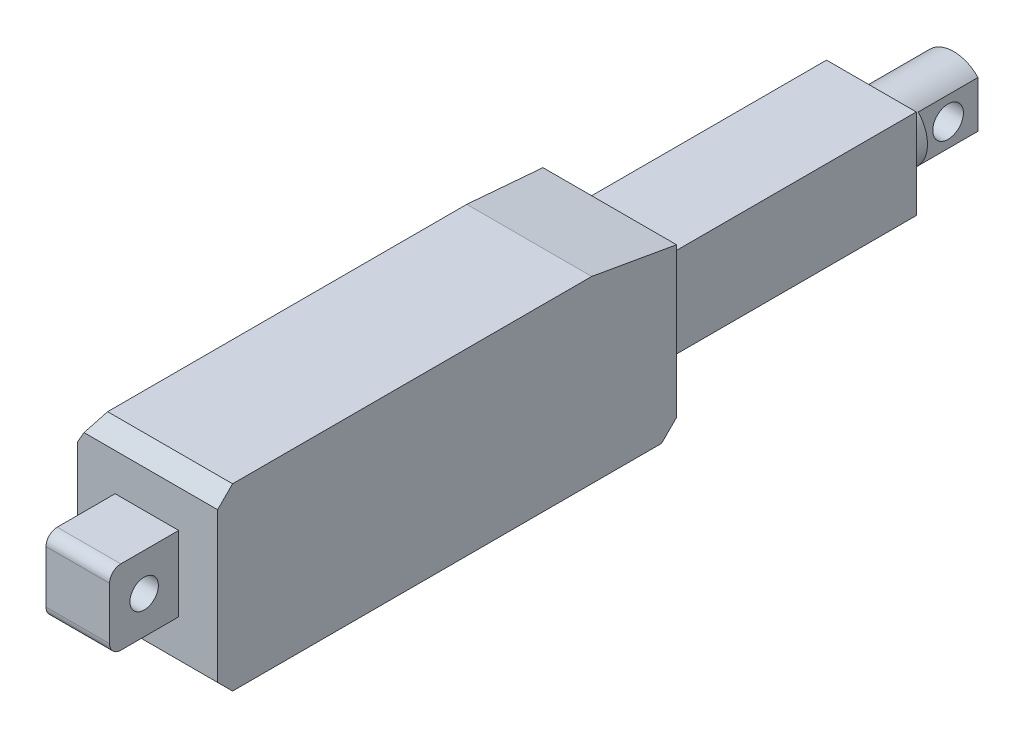
ISO-10303-21;
HEADER;
FILE_DESCRIPTION(('STEP AP214'),'2;1');
FILE_NAME('part.step','',(''),(''),'','','');
FILE_SCHEMA(('AUTOMOTIVE_DESIGN { 1 0 10303 214 1 1 1 1 }'));
ENDSEC;
DATA;
#1=APPLICATION_CONTEXT('core data for automotive mechanical design processes');
#2=APPLICATION_PROTOCOL_DEFINITION('international standard','automotive_design',2000,#1);
#3=PRODUCT_CONTEXT('',#1,'mechanical');
#4=PRODUCT('Part','Part','',(#3));
#5=PRODUCT_RELATED_PRODUCT_CATEGORY('part','',(#4));
#6=PRODUCT_DEFINITION_FORMATION('','',#4);
#7=PRODUCT_DEFINITION_CONTEXT('part definition',#1,'design');
#8=PRODUCT_DEFINITION('design','',#6,#7);
#9=PRODUCT_DEFINITION_SHAPE('','',#8);
#10=(LENGTH_UNIT() NAMED_UNIT(*) SI_UNIT(.MILLI.,.METRE.));
#11=(NAMED_UNIT(*) PLANE_ANGLE_UNIT() SI_UNIT($,.RADIAN.));
#12=(NAMED_UNIT(*) SI_UNIT($,.STERADIAN.) SOLID_ANGLE_UNIT());
#13=UNCERTAINTY_MEASURE_WITH_UNIT(LENGTH_MEASURE(1.E-05),#10,'distance_accuracy_value','');
#14=(GEOMETRIC_REPRESENTATION_CONTEXT(3) GLOBAL_UNCERTAINTY_ASSIGNED_CONTEXT((#13)) GLOBAL_UNIT_ASSIGNED_CONTEXT((#10,
#11,#12)) REPRESENTATION_CONTEXT('',''));
#15=CARTESIAN_POINT('',(0.,0.,0.));
#16=DIRECTION('',(0.,0.,1.));
#17=DIRECTION('',(1.,0.,0.));
#18=AXIS2_PLACEMENT_3D('',#15,#16,#17);
#19=CARTESIAN_POINT('',(0.,0.,-46.4));
#20=DIRECTION('',(0.,0.,1.));
#21=DIRECTION('',(1.,0.,0.));
#22=AXIS2_PLACEMENT_3D('',#19,#20,#21);
#23=CYLINDRICAL_SURFACE('',#22,4.5);
#24=CARTESIAN_POINT('',(0.,0.,-46.4));
#25=DIRECTION('',(0.,0.,-1.));
#26=DIRECTION('',(-1.,0.,0.));
#27=AXIS2_PLACEMENT_3D('',#24,#25,#26);
#28=CIRCLE('',#27,4.5);
#29=CARTESIAN_POINT('',(3.25,-3.11247489949718,-46.4));
#30=VERTEX_POINT('',#29);
#31=CARTESIAN_POINT('',(-3.25,-3.11247489949718,-46.4));
#32=VERTEX_POINT('',#31);
#33=EDGE_CURVE('E243',#30,#32,#28,.T.);
#34=ORIENTED_EDGE('',*,*,#33,.F.);
#35=DIRECTION('',(0.,0.,-1.));
#36=VECTOR('',#35,1.);
#37=CARTESIAN_POINT('',(3.25,-3.11247489949718,-38.4));
#38=LINE('',#37,#36);
#39=CARTESIAN_POINT('',(3.25,-3.11247489949718,-38.4));
#40=VERTEX_POINT('',#39);
#41=EDGE_CURVE('E237',#40,#30,#38,.T.);
#42=ORIENTED_EDGE('',*,*,#41,.F.);
#43=CARTESIAN_POINT('',(0.,0.,-38.4));
#44=DIRECTION('',(0.,0.,-1.));
#45=DIRECTION('',(-1.,0.,0.));
#46=AXIS2_PLACEMENT_3D('',#43,#44,#45);
#47=CIRCLE('',#46,4.5);
#48=CARTESIAN_POINT('',(3.25,3.11247489949718,-38.4));
#49=VERTEX_POINT('',#48);
#50=EDGE_CURVE('E231',#49,#40,#47,.T.);
#51=ORIENTED_EDGE('',*,*,#50,.F.);
#52=DIRECTION('',(0.,0.,-1.));
#53=VECTOR('',#52,1.);
#54=CARTESIAN_POINT('',(3.25,3.11247489949718,-38.4));
#55=LINE('',#54,#53);
#56=CARTESIAN_POINT('',(3.25,3.11247489949718,-46.4));
#57=VERTEX_POINT('',#56);
#58=EDGE_CURVE('E240',#49,#57,#55,.T.);
#59=ORIENTED_EDGE('',*,*,#58,.T.);
#60=CARTESIAN_POINT('',(-3.25,3.11247489949718,-46.4));
#61=VERTEX_POINT('',#60);
#62=EDGE_CURVE('E256',#61,#57,#28,.T.);
#63=ORIENTED_EDGE('',*,*,#62,.F.);
#64=DIRECTION('',(0.,0.,-1.));
#65=VECTOR('',#64,1.);
#66=CARTESIAN_POINT('',(-3.25,3.11247489949718,-38.4));
#67=LINE('',#66,#65);
#68=CARTESIAN_POINT('',(-3.25,3.11247489949718,-38.4));
#69=VERTEX_POINT('',#68);
#70=EDGE_CURVE('E239',#69,#61,#67,.T.);
#71=ORIENTED_EDGE('',*,*,#70,.F.);
#72=CARTESIAN_POINT('',(0.,0.,-38.4));
#73=DIRECTION('',(0.,0.,-1.));
#74=DIRECTION('',(-1.,0.,0.));
#75=AXIS2_PLACEMENT_3D('',#72,#73,#74);
#76=CIRCLE('',#75,4.5);
#77=CARTESIAN_POINT('',(-3.25,-3.11247489949718,-38.4));
#78=VERTEX_POINT('',#77);
#79=EDGE_CURVE('E247',#78,#69,#76,.T.);
#80=ORIENTED_EDGE('',*,*,#79,.F.);
#81=DIRECTION('',(0.,0.,-1.));
#82=VECTOR('',#81,1.);
#83=CARTESIAN_POINT('',(-3.25,-3.11247489949718,-38.4));
#84=LINE('',#83,#82);
#85=EDGE_CURVE('E250',#78,#32,#84,.T.);
#86=ORIENTED_EDGE('',*,*,#85,.T.);
#87=EDGE_LOOP('',(#34,#42,#51,#59,#63,#71,#80,#86));
#88=FACE_BOUND('',#87,.T.);
#89=CARTESIAN_POINT('',(0.,0.,-35.4));
#90=DIRECTION('',(0.,0.,-1.));
#91=DIRECTION('',(-1.,0.,0.));
#92=AXIS2_PLACEMENT_3D('',#89,#90,#91);
#93=CIRCLE('',#92,4.5);
#94=CARTESIAN_POINT('',(-4.5,0.,-35.4));
#95=VERTEX_POINT('',#94);
#96=EDGE_CURVE('E260',#95,#95,#93,.T.);
#97=ORIENTED_EDGE('',*,*,#96,.T.);
#98=EDGE_LOOP('',(#97));
#99=FACE_BOUND('',#98,.T.);
#100=ADVANCED_FACE('F35',(#88,#99),#23,.T.);
#101=CARTESIAN_POINT('',(0.,0.,-46.4));
#102=DIRECTION('',(0.,0.,-1.));
#103=DIRECTION('',(-1.,0.,0.));
#104=AXIS2_PLACEMENT_3D('',#101,#102,#103);
#105=PLANE('',#104);
#106=DIRECTION('',(0.,1.,0.));
#107=VECTOR('',#106,1.);
#108=CARTESIAN_POINT('',(3.25,0.,-46.4));
#109=LINE('',#108,#107);
#110=EDGE_CURVE('E234',#30,#57,#109,.T.);
#111=ORIENTED_EDGE('',*,*,#110,.F.);
#112=ORIENTED_EDGE('',*,*,#33,.T.);
#113=DIRECTION('',(0.,1.,0.));
#114=VECTOR('',#113,1.);
#115=CARTESIAN_POINT('',(-3.25,0.,-46.4));
#116=LINE('',#115,#114);
#117=EDGE_CURVE('E230',#32,#61,#116,.T.);
#118=ORIENTED_EDGE('',*,*,#117,.T.);
#119=ORIENTED_EDGE('',*,*,#62,.T.);
#120=EDGE_LOOP('',(#111,#112,#118,#119));
#121=FACE_BOUND('',#120,.T.);
#122=ADVANCED_FACE('F408',(#121),#105,.T.);
#123=CARTESIAN_POINT('',(0.,0.,0.));
#124=DIRECTION('',(0.,0.,1.));
#125=DIRECTION('',(1.,0.,0.));
#126=AXIS2_PLACEMENT_3D('',#123,#124,#125);
#127=PLANE('',#126);
#128=DIRECTION('',(-0.5,-0.866025403784439,0.));
#129=VECTOR('',#128,1.);
#130=CARTESIAN_POINT('',(-9.34999999999999,8.53589838486224,0.));
#131=LINE('',#130,#129);
#132=CARTESIAN_POINT('',(-9.34999999999999,8.53589838486224,0.));
#133=VERTEX_POINT('',#132);
#134=CARTESIAN_POINT('',(-8.50470053837924,10.,0.));
#135=VERTEX_POINT('',#134);
#136=EDGE_CURVE('E322',#133,#135,#131,.F.);
#137=ORIENTED_EDGE('',*,*,#136,.T.);
#138=DIRECTION('',(1.,0.,0.));
#139=VECTOR('',#138,1.);
#140=CARTESIAN_POINT('',(0.,10.,0.));
#141=LINE('',#140,#139);
#142=CARTESIAN_POINT('',(9.35000000000001,10.,0.));
#143=VERTEX_POINT('',#142);
#144=EDGE_CURVE('E368',#135,#143,#141,.T.);
#145=ORIENTED_EDGE('',*,*,#144,.T.);
#146=DIRECTION('',(0.,1.,0.));
#147=VECTOR('',#146,1.);
#148=CARTESIAN_POINT('',(9.35000000000001,-12.,0.));
#149=LINE('',#148,#147);
#150=CARTESIAN_POINT('',(9.35000000000001,-9.99999999999999,0.));
#151=VERTEX_POINT('',#150);
#152=EDGE_CURVE('E302',#151,#143,#149,.T.);
#153=ORIENTED_EDGE('',*,*,#152,.F.);
#154=DIRECTION('',(-1.,0.,0.));
#155=VECTOR('',#154,1.);
#156=CARTESIAN_POINT('',(0.,-9.99999999999999,0.));
#157=LINE('',#156,#155);
#158=CARTESIAN_POINT('',(-8.50470053837926,-9.99999999999999,0.));
#159=VERTEX_POINT('',#158);
#160=EDGE_CURVE('E361',#151,#159,#157,.T.);
#161=ORIENTED_EDGE('',*,*,#160,.T.);
#162=DIRECTION('',(0.500000000000001,-0.866025403784438,0.));
#163=VECTOR('',#162,1.);
#164=CARTESIAN_POINT('',(-7.35,-12.,0.));
#165=LINE('',#164,#163);
#166=CARTESIAN_POINT('',(-9.34999999999999,-8.53589838486226,0.));
#167=VERTEX_POINT('',#166);
#168=EDGE_CURVE('E320',#159,#167,#165,.F.);
#169=ORIENTED_EDGE('',*,*,#168,.T.);
#170=DIRECTION('',(0.,-1.,0.));
#171=VECTOR('',#170,1.);
#172=CARTESIAN_POINT('',(-9.34999999999999,-12.,0.));
#173=LINE('',#172,#171);
#174=EDGE_CURVE('E297',#133,#167,#173,.T.);
#175=ORIENTED_EDGE('',*,*,#174,.F.);
#176=EDGE_LOOP('',(#137,#145,#153,#161,#169,#175));
#177=FACE_BOUND('',#176,.T.);
#178=DIRECTION('',(0.,-1.,0.));
#179=VECTOR('',#178,1.);
#180=CARTESIAN_POINT('',(6.,-6.,0.));
#181=LINE('',#180,#179);
#182=CARTESIAN_POINT('',(6.,6.,0.));
#183=VERTEX_POINT('',#182);
#184=CARTESIAN_POINT('',(6.,-6.,0.));
#185=VERTEX_POINT('',#184);
#186=EDGE_CURVE('E259',#183,#185,#181,.T.);
#187=ORIENTED_EDGE('',*,*,#186,.F.);
#188=DIRECTION('',(1.,0.,0.));
#189=VECTOR('',#188,1.);
#190=CARTESIAN_POINT('',(-6.,6.,0.));
#191=LINE('',#190,#189);
#192=CARTESIAN_POINT('',(-6.,6.,0.));
#193=VERTEX_POINT('',#192);
#194=EDGE_CURVE('E269',#193,#183,#191,.T.);
#195=ORIENTED_EDGE('',*,*,#194,.F.);
#196=DIRECTION('',(0.,1.,0.));
#197=VECTOR('',#196,1.);
#198=CARTESIAN_POINT('',(-6.,-6.,0.));
#199=LINE('',#198,#197);
#200=CARTESIAN_POINT('',(-6.,-6.,0.));
#201=VERTEX_POINT('',#200);
#202=EDGE_CURVE('E281',#201,#193,#199,.T.);
#203=ORIENTED_EDGE('',*,*,#202,.F.);
#204=DIRECTION('',(-1.,0.,0.));
#205=VECTOR('',#204,1.);
#206=CARTESIAN_POINT('',(-6.,-6.,0.));
#207=LINE('',#206,#205);
#208=EDGE_CURVE('E278',#185,#201,#207,.T.);
#209=ORIENTED_EDGE('',*,*,#208,.F.);
#210=EDGE_LOOP('',(#187,#195,#203,#209));
#211=FACE_BOUND('',#210,.T.);
#212=ADVANCED_FACE('F414',(#177,#211),#127,.F.);
#213=CARTESIAN_POINT('',(-9.34999999999999,-12.,61.35));
#214=DIRECTION('',(1.,0.,0.));
#215=DIRECTION('',(0.,1.,0.));
#216=AXIS2_PLACEMENT_3D('',#213,#214,#215);
#217=PLANE('',#216);
#218=DIRECTION('',(0.,-1.,0.));
#219=VECTOR('',#218,1.);
#220=CARTESIAN_POINT('',(-9.34999999999999,-12.,61.35));
#221=LINE('',#220,#219);
#222=CARTESIAN_POINT('',(-9.34999999999999,8.53589838486224,61.35));
#223=VERTEX_POINT('',#222);
#224=CARTESIAN_POINT('',(-9.34999999999999,-8.53589838486226,61.35));
#225=VERTEX_POINT('',#224);
#226=EDGE_CURVE('E298',#223,#225,#221,.T.);
#227=ORIENTED_EDGE('',*,*,#226,.F.);
#228=DIRECTION('',(0.,0.,-1.));
#229=VECTOR('',#228,1.);
#230=CARTESIAN_POINT('',(-9.34999999999999,8.53589838486224,61.35));
#231=LINE('',#230,#229);
#232=EDGE_CURVE('E317',#223,#133,#231,.T.);
#233=ORIENTED_EDGE('',*,*,#232,.T.);
#234=ORIENTED_EDGE('',*,*,#174,.T.);
#235=DIRECTION('',(0.,0.,1.));
#236=VECTOR('',#235,1.);
#237=CARTESIAN_POINT('',(-9.34999999999999,-8.53589838486226,61.35));
#238=LINE('',#237,#236);
#239=EDGE_CURVE('E315',#167,#225,#238,.T.);
#240=ORIENTED_EDGE('',*,*,#239,.T.);
#241=EDGE_LOOP('',(#227,#233,#234,#240));
#242=FACE_BOUND('',#241,.T.);
#243=ADVANCED_FACE('F449',(#242),#217,.F.);
#244=CARTESIAN_POINT('',(9.35000000000001,-12.,61.35));
#245=DIRECTION('',(0.,1.,0.));
#246=DIRECTION('',(-1.,0.,0.));
#247=AXIS2_PLACEMENT_3D('',#244,#245,#246);
#248=PLANE('',#247);
#249=DIRECTION('',(0.,0.,-1.));
#250=VECTOR('',#249,1.);
#251=CARTESIAN_POINT('',(9.35000000000001,-12.,61.35));
#252=LINE('',#251,#250);
#253=CARTESIAN_POINT('',(9.35000000000001,-12.,59.35));
#254=VERTEX_POINT('',#253);
#255=CARTESIAN_POINT('',(9.35000000000001,-12.,1.99999999999999));
#256=VERTEX_POINT('',#255);
#257=EDGE_CURVE('E312',#254,#256,#252,.T.);
#258=ORIENTED_EDGE('',*,*,#257,.F.);
#259=DIRECTION('',(-1.,0.,0.));
#260=VECTOR('',#259,1.);
#261=CARTESIAN_POINT('',(-7.35,-12.,59.35));
#262=LINE('',#261,#260);
#263=CARTESIAN_POINT('',(-7.35,-12.,59.35));
#264=VERTEX_POINT('',#263);
#265=EDGE_CURVE('E355',#254,#264,#262,.T.);
#266=ORIENTED_EDGE('',*,*,#265,.T.);
#267=DIRECTION('',(0.,0.,-1.));
#268=VECTOR('',#267,1.);
#269=CARTESIAN_POINT('',(-7.35,-12.,61.35));
#270=LINE('',#269,#268);
#271=CARTESIAN_POINT('',(-7.35,-12.,1.99999999999999));
#272=VERTEX_POINT('',#271);
#273=EDGE_CURVE('E332',#264,#272,#270,.T.);
#274=ORIENTED_EDGE('',*,*,#273,.T.);
#275=DIRECTION('',(1.,0.,0.));
#276=VECTOR('',#275,1.);
#277=CARTESIAN_POINT('',(9.35000000000001,-12.,1.99999999999999));
#278=LINE('',#277,#276);
#279=EDGE_CURVE('E352',#272,#256,#278,.T.);
#280=ORIENTED_EDGE('',*,*,#279,.T.);
#281=EDGE_LOOP('',(#258,#266,#274,#280));
#282=FACE_BOUND('',#281,.T.);
#283=ADVANCED_FACE('F457',(#282),#248,.F.);
#284=CARTESIAN_POINT('',(9.35000000000001,-12.,61.35));
#285=DIRECTION('',(-1.,0.,0.));
#286=DIRECTION('',(0.,0.,1.));
#287=AXIS2_PLACEMENT_3D('',#284,#285,#286);
#288=PLANE('',#287);
#289=ORIENTED_EDGE('',*,*,#152,.T.);
#290=DIRECTION('',(0.,-0.173648177666931,-0.984807753012208));
#291=VECTOR('',#290,1.);
#292=CARTESIAN_POINT('',(9.35000000000001,12.,11.3425636392354));
#293=LINE('',#292,#291);
#294=CARTESIAN_POINT('',(9.35000000000001,12.,11.3425636392354));
#295=VERTEX_POINT('',#294);
#296=EDGE_CURVE('E264',#143,#295,#293,.F.);
#297=ORIENTED_EDGE('',*,*,#296,.T.);
#298=DIRECTION('',(0.,0.,-1.));
#299=VECTOR('',#298,1.);
#300=CARTESIAN_POINT('',(9.35000000000001,12.,61.35));
#301=LINE('',#300,#299);
#302=CARTESIAN_POINT('',(9.35000000000001,12.,59.35));
#303=VERTEX_POINT('',#302);
#304=EDGE_CURVE('E305',#303,#295,#301,.T.);
#305=ORIENTED_EDGE('',*,*,#304,.F.);
#306=DIRECTION('',(0.,-0.707106781186545,0.70710678118655));
#307=VECTOR('',#306,1.);
#308=CARTESIAN_POINT('',(9.35000000000001,10.,61.35));
#309=LINE('',#308,#307);
#310=CARTESIAN_POINT('',(9.35000000000001,10.,61.35));
#311=VERTEX_POINT('',#310);
#312=EDGE_CURVE('E350',#303,#311,#309,.T.);
#313=ORIENTED_EDGE('',*,*,#312,.T.);
#314=DIRECTION('',(0.,1.,0.));
#315=VECTOR('',#314,1.);
#316=CARTESIAN_POINT('',(9.35000000000001,-12.,61.35));
#317=LINE('',#316,#315);
#318=CARTESIAN_POINT('',(9.35000000000001,-10.,61.35));
#319=VERTEX_POINT('',#318);
#320=EDGE_CURVE('E301',#319,#311,#317,.T.);
#321=ORIENTED_EDGE('',*,*,#320,.F.);
#322=DIRECTION('',(0.,-0.707106781186545,-0.70710678118655));
#323=VECTOR('',#322,1.);
#324=CARTESIAN_POINT('',(9.35000000000001,-10.,61.35));
#325=LINE('',#324,#323);
#326=EDGE_CURVE('E348',#319,#254,#325,.T.);
#327=ORIENTED_EDGE('',*,*,#326,.T.);
#328=ORIENTED_EDGE('',*,*,#257,.T.);
#329=DIRECTION('',(0.,-0.70710678118655,0.707106781186545));
#330=VECTOR('',#329,1.);
#331=CARTESIAN_POINT('',(9.35000000000001,-12.,1.99999999999999));
#332=LINE('',#331,#330);
#333=EDGE_CURVE('E346',#256,#151,#332,.F.);
#334=ORIENTED_EDGE('',*,*,#333,.T.);
#335=EDGE_LOOP('',(#289,#297,#305,#313,#321,#327,#328,#334));
#336=FACE_BOUND('',#335,.T.);
#337=ADVANCED_FACE('F453',(#336),#288,.F.);
#338=CARTESIAN_POINT('',(9.35000000000001,12.,61.35));
#339=DIRECTION('',(0.,-1.,0.));
#340=DIRECTION('',(1.,0.,0.));
#341=AXIS2_PLACEMENT_3D('',#338,#339,#340);
#342=PLANE('',#341);
#343=ORIENTED_EDGE('',*,*,#304,.T.);
#344=DIRECTION('',(-1.,0.,0.));
#345=VECTOR('',#344,1.);
#346=CARTESIAN_POINT('',(9.35000000000001,12.,11.3425636392354));
#347=LINE('',#346,#345);
#348=CARTESIAN_POINT('',(-7.34999999999999,12.,11.3425636392354));
#349=VERTEX_POINT('',#348);
#350=EDGE_CURVE('E363',#295,#349,#347,.T.);
#351=ORIENTED_EDGE('',*,*,#350,.T.);
#352=DIRECTION('',(0.,0.,1.));
#353=VECTOR('',#352,1.);
#354=CARTESIAN_POINT('',(-7.34999999999999,12.,61.35));
#355=LINE('',#354,#353);
#356=CARTESIAN_POINT('',(-7.34999999999999,12.,59.35));
#357=VERTEX_POINT('',#356);
#358=EDGE_CURVE('E325',#349,#357,#355,.T.);
#359=ORIENTED_EDGE('',*,*,#358,.T.);
#360=DIRECTION('',(1.,0.,0.));
#361=VECTOR('',#360,1.);
#362=CARTESIAN_POINT('',(9.35000000000001,12.,59.35));
#363=LINE('',#362,#361);
#364=EDGE_CURVE('E344',#357,#303,#363,.T.);
#365=ORIENTED_EDGE('',*,*,#364,.T.);
#366=EDGE_LOOP('',(#343,#351,#359,#365));
#367=FACE_BOUND('',#366,.T.);
#368=ADVANCED_FACE('F446',(#367),#342,.F.);
#369=CARTESIAN_POINT('',(0.,0.,61.35));
#370=DIRECTION('',(0.,0.,1.));
#371=DIRECTION('',(1.,0.,0.));
#372=AXIS2_PLACEMENT_3D('',#369,#370,#371);
#373=PLANE('',#372);
#374=DIRECTION('',(0.,1.,0.));
#375=VECTOR('',#374,1.);
#376=CARTESIAN_POINT('',(4.15000000000001,-5.,61.35));
#377=LINE('',#376,#375);
#378=CARTESIAN_POINT('',(4.15000000000001,-5.,61.35));
#379=VERTEX_POINT('',#378);
#380=CARTESIAN_POINT('',(4.15000000000001,5.,61.35));
#381=VERTEX_POINT('',#380);
#382=EDGE_CURVE('E217',#379,#381,#377,.T.);
#383=ORIENTED_EDGE('',*,*,#382,.F.);
#384=DIRECTION('',(1.,0.,0.));
#385=VECTOR('',#384,1.);
#386=CARTESIAN_POINT('',(-4.34999999999999,-5.,61.35));
#387=LINE('',#386,#385);
#388=CARTESIAN_POINT('',(-4.34999999999999,-5.,61.35));
#389=VERTEX_POINT('',#388);
#390=EDGE_CURVE('E213',#389,#379,#387,.T.);
#391=ORIENTED_EDGE('',*,*,#390,.F.);
#392=DIRECTION('',(0.,-1.,0.));
#393=VECTOR('',#392,1.);
#394=CARTESIAN_POINT('',(-4.34999999999999,-5.,61.35));
#395=LINE('',#394,#393);
#396=CARTESIAN_POINT('',(-4.34999999999999,5.,61.35));
#397=VERTEX_POINT('',#396);
#398=EDGE_CURVE('E197',#397,#389,#395,.T.);
#399=ORIENTED_EDGE('',*,*,#398,.F.);
#400=DIRECTION('',(-1.,0.,0.));
#401=VECTOR('',#400,1.);
#402=CARTESIAN_POINT('',(-4.34999999999999,5.,61.35));
#403=LINE('',#402,#401);
#404=EDGE_CURVE('E210',#381,#397,#403,.T.);
#405=ORIENTED_EDGE('',*,*,#404,.F.);
#406=EDGE_LOOP('',(#383,#391,#399,#405));
#407=FACE_BOUND('',#406,.T.);
#408=ORIENTED_EDGE('',*,*,#320,.T.);
#409=DIRECTION('',(-1.,0.,0.));
#410=VECTOR('',#409,1.);
#411=CARTESIAN_POINT('',(-7.34999999999999,10.,61.35));
#412=LINE('',#411,#410);
#413=CARTESIAN_POINT('',(-8.50470053837924,10.,61.35));
#414=VERTEX_POINT('',#413);
#415=EDGE_CURVE('E338',#311,#414,#412,.T.);
#416=ORIENTED_EDGE('',*,*,#415,.T.);
#417=DIRECTION('',(0.5,0.866025403784439,0.));
#418=VECTOR('',#417,1.);
#419=CARTESIAN_POINT('',(-10.7086524227066,6.18264335890781,61.35));
#420=LINE('',#419,#418);
#421=EDGE_CURVE('E330',#414,#223,#420,.F.);
#422=ORIENTED_EDGE('',*,*,#421,.T.);
#423=ORIENTED_EDGE('',*,*,#226,.T.);
#424=DIRECTION('',(-0.500000000000001,0.866025403784438,0.));
#425=VECTOR('',#424,1.);
#426=CARTESIAN_POINT('',(-10.7086524227066,-6.18264335890782,61.35));
#427=LINE('',#426,#425);
#428=CARTESIAN_POINT('',(-8.50470053837925,-10.,61.35));
#429=VERTEX_POINT('',#428);
#430=EDGE_CURVE('E327',#225,#429,#427,.F.);
#431=ORIENTED_EDGE('',*,*,#430,.T.);
#432=DIRECTION('',(1.,0.,0.));
#433=VECTOR('',#432,1.);
#434=CARTESIAN_POINT('',(9.35000000000001,-10.,61.35));
#435=LINE('',#434,#433);
#436=EDGE_CURVE('E335',#429,#319,#435,.T.);
#437=ORIENTED_EDGE('',*,*,#436,.T.);
#438=EDGE_LOOP('',(#408,#416,#422,#423,#431,#437));
#439=FACE_BOUND('',#438,.T.);
#440=ADVANCED_FACE('F208',(#407,#439),#373,.T.);
#441=CARTESIAN_POINT('',(-9.34999999999999,8.53589838486224,61.35));
#442=DIRECTION('',(0.866025403784439,-0.5,0.));
#443=DIRECTION('',(0.,0.,-1.));
#444=AXIS2_PLACEMENT_3D('',#441,#442,#443);
#445=PLANE('',#444);
#446=ORIENTED_EDGE('',*,*,#358,.F.);
#447=DIRECTION('',(-0.0997557416394321,-0.172782012866211,-0.97989548832509));
#448=VECTOR('',#447,1.);
#449=CARTESIAN_POINT('',(-2.54137269980942,20.3287867985928,58.5774607895667));
#450=LINE('',#449,#448);
#451=EDGE_CURVE('E366',#349,#135,#450,.T.);
#452=ORIENTED_EDGE('',*,*,#451,.T.);
#453=ORIENTED_EDGE('',*,*,#136,.F.);
#454=ORIENTED_EDGE('',*,*,#232,.F.);
#455=ORIENTED_EDGE('',*,*,#421,.F.);
#456=DIRECTION('',(-0.377964473009226,-0.654653670707975,0.65465367070798));
#457=VECTOR('',#456,1.);
#458=CARTESIAN_POINT('',(-8.98772880216252,9.16337050563557,62.1866294943644));
#459=LINE('',#458,#457);
#460=EDGE_CURVE('E341',#414,#357,#459,.F.);
#461=ORIENTED_EDGE('',*,*,#460,.T.);
#462=EDGE_LOOP('',(#446,#452,#453,#454,#455,#461));
#463=FACE_BOUND('',#462,.T.);
#464=ADVANCED_FACE('F445',(#463),#445,.F.);
#465=CARTESIAN_POINT('',(-7.35,-12.,61.35));
#466=DIRECTION('',(0.866025403784438,0.500000000000001,0.));
#467=DIRECTION('',(0.,0.,-1.));
#468=AXIS2_PLACEMENT_3D('',#465,#466,#467);
#469=PLANE('',#468);
#470=ORIENTED_EDGE('',*,*,#273,.F.);
#471=DIRECTION('',(0.377964473009227,-0.654653670707975,-0.65465367070798));
#472=VECTOR('',#471,1.);
#473=CARTESIAN_POINT('',(-7.8448716593054,-11.1428571428571,60.2071428571429));
#474=LINE('',#473,#472);
#475=EDGE_CURVE('E359',#264,#429,#474,.F.);
#476=ORIENTED_EDGE('',*,*,#475,.T.);
#477=ORIENTED_EDGE('',*,*,#430,.F.);
#478=ORIENTED_EDGE('',*,*,#239,.F.);
#479=ORIENTED_EDGE('',*,*,#168,.F.);
#480=DIRECTION('',(0.377964473009229,-0.654653670707979,0.654653670707975));
#481=VECTOR('',#480,1.);
#482=CARTESIAN_POINT('',(7.33531648988756,-37.4357142857143,27.4357142857141));
#483=LINE('',#482,#481);
#484=EDGE_CURVE('E357',#159,#272,#483,.T.);
#485=ORIENTED_EDGE('',*,*,#484,.T.);
#486=EDGE_LOOP('',(#470,#476,#477,#478,#479,#485));
#487=FACE_BOUND('',#486,.T.);
#488=ADVANCED_FACE('F471',(#487),#469,.F.);
#489=CARTESIAN_POINT('',(0.,10.,61.35));
#490=DIRECTION('',(0.,0.70710678118655,0.707106781186545));
#491=DIRECTION('',(1.,0.,0.));
#492=AXIS2_PLACEMENT_3D('',#489,#490,#491);
#493=PLANE('',#492);
#494=ORIENTED_EDGE('',*,*,#312,.F.);
#495=ORIENTED_EDGE('',*,*,#364,.F.);
#496=ORIENTED_EDGE('',*,*,#460,.F.);
#497=ORIENTED_EDGE('',*,*,#415,.F.);
#498=EDGE_LOOP('',(#494,#495,#496,#497));
#499=FACE_BOUND('',#498,.T.);
#500=ADVANCED_FACE('F478',(#499),#493,.T.);
#501=CARTESIAN_POINT('',(0.,-10.,61.35));
#502=DIRECTION('',(0.,-0.70710678118655,0.707106781186545));
#503=DIRECTION('',(-1.,0.,0.));
#504=AXIS2_PLACEMENT_3D('',#501,#502,#503);
#505=PLANE('',#504);
#506=ORIENTED_EDGE('',*,*,#475,.F.);
#507=ORIENTED_EDGE('',*,*,#265,.F.);
#508=ORIENTED_EDGE('',*,*,#326,.F.);
#509=ORIENTED_EDGE('',*,*,#436,.F.);
#510=EDGE_LOOP('',(#506,#507,#508,#509));
#511=FACE_BOUND('',#510,.T.);
#512=ADVANCED_FACE('F485',(#511),#505,.T.);
#513=CARTESIAN_POINT('',(9.35000000000001,-12.,1.99999999999999));
#514=DIRECTION('',(0.,0.707106781186545,0.70710678118655));
#515=DIRECTION('',(1.,0.,0.));
#516=AXIS2_PLACEMENT_3D('',#513,#514,#515);
#517=PLANE('',#516);
#518=ORIENTED_EDGE('',*,*,#484,.F.);
#519=ORIENTED_EDGE('',*,*,#160,.F.);
#520=ORIENTED_EDGE('',*,*,#333,.F.);
#521=ORIENTED_EDGE('',*,*,#279,.F.);
#522=EDGE_LOOP('',(#518,#519,#520,#521));
#523=FACE_BOUND('',#522,.T.);
#524=ADVANCED_FACE('F492',(#523),#517,.F.);
#525=CARTESIAN_POINT('',(9.35000000000001,12.,11.3425636392354));
#526=DIRECTION('',(0.,-0.984807753012208,0.173648177666931));
#527=DIRECTION('',(-1.,0.,0.));
#528=AXIS2_PLACEMENT_3D('',#525,#526,#527);
#529=PLANE('',#528);
#530=ORIENTED_EDGE('',*,*,#296,.F.);
#531=ORIENTED_EDGE('',*,*,#144,.F.);
#532=ORIENTED_EDGE('',*,*,#451,.F.);
#533=ORIENTED_EDGE('',*,*,#350,.F.);
#534=EDGE_LOOP('',(#530,#531,#532,#533));
#535=FACE_BOUND('',#534,.T.);
#536=ADVANCED_FACE('F441',(#535),#529,.F.);
#537=CARTESIAN_POINT('',(6.,-6.,-35.4));
#538=DIRECTION('',(-1.,0.,0.));
#539=DIRECTION('',(0.,0.,1.));
#540=AXIS2_PLACEMENT_3D('',#537,#538,#539);
#541=PLANE('',#540);
#542=ORIENTED_EDGE('',*,*,#186,.T.);
#543=DIRECTION('',(0.,0.,1.));
#544=VECTOR('',#543,1.);
#545=CARTESIAN_POINT('',(6.,-6.,-35.4));
#546=LINE('',#545,#544);
#547=CARTESIAN_POINT('',(6.,-6.,-35.4));
#548=VERTEX_POINT('',#547);
#549=EDGE_CURVE('E294',#548,#185,#546,.T.);
#550=ORIENTED_EDGE('',*,*,#549,.F.);
#551=DIRECTION('',(0.,-1.,0.));
#552=VECTOR('',#551,1.);
#553=CARTESIAN_POINT('',(6.,-6.,-35.4));
#554=LINE('',#553,#552);
#555=CARTESIAN_POINT('',(6.,6.,-35.4));
#556=VERTEX_POINT('',#555);
#557=EDGE_CURVE('E265',#556,#548,#554,.T.);
#558=ORIENTED_EDGE('',*,*,#557,.F.);
#559=DIRECTION('',(0.,0.,1.));
#560=VECTOR('',#559,1.);
#561=CARTESIAN_POINT('',(6.,6.,-35.4));
#562=LINE('',#561,#560);
#563=EDGE_CURVE('E275',#556,#183,#562,.T.);
#564=ORIENTED_EDGE('',*,*,#563,.T.);
#565=EDGE_LOOP('',(#542,#550,#558,#564));
#566=FACE_BOUND('',#565,.T.);
#567=ADVANCED_FACE('F437',(#566),#541,.F.);
#568=CARTESIAN_POINT('',(-6.,-6.,-35.4));
#569=DIRECTION('',(0.,1.,0.));
#570=DIRECTION('',(-1.,0.,0.));
#571=AXIS2_PLACEMENT_3D('',#568,#569,#570);
#572=PLANE('',#571);
#573=ORIENTED_EDGE('',*,*,#208,.T.);
#574=DIRECTION('',(0.,0.,1.));
#575=VECTOR('',#574,1.);
#576=CARTESIAN_POINT('',(-6.,-6.,-35.4));
#577=LINE('',#576,#575);
#578=CARTESIAN_POINT('',(-6.,-6.,-35.4));
#579=VERTEX_POINT('',#578);
#580=EDGE_CURVE('E291',#579,#201,#577,.T.);
#581=ORIENTED_EDGE('',*,*,#580,.F.);
#582=DIRECTION('',(-1.,0.,0.));
#583=VECTOR('',#582,1.);
#584=CARTESIAN_POINT('',(-6.,-6.,-35.4));
#585=LINE('',#584,#583);
#586=EDGE_CURVE('E268',#548,#579,#585,.T.);
#587=ORIENTED_EDGE('',*,*,#586,.F.);
#588=ORIENTED_EDGE('',*,*,#549,.T.);
#589=EDGE_LOOP('',(#573,#581,#587,#588));
#590=FACE_BOUND('',#589,.T.);
#591=ADVANCED_FACE('F433',(#590),#572,.F.);
#592=CARTESIAN_POINT('',(-6.,-6.,-35.4));
#593=DIRECTION('',(1.,0.,0.));
#594=DIRECTION('',(0.,1.,0.));
#595=AXIS2_PLACEMENT_3D('',#592,#593,#594);
#596=PLANE('',#595);
#597=ORIENTED_EDGE('',*,*,#202,.T.);
#598=DIRECTION('',(0.,0.,1.));
#599=VECTOR('',#598,1.);
#600=CARTESIAN_POINT('',(-6.,6.,-35.4));
#601=LINE('',#600,#599);
#602=CARTESIAN_POINT('',(-6.,6.,-35.4));
#603=VERTEX_POINT('',#602);
#604=EDGE_CURVE('E288',#603,#193,#601,.T.);
#605=ORIENTED_EDGE('',*,*,#604,.F.);
#606=DIRECTION('',(0.,1.,0.));
#607=VECTOR('',#606,1.);
#608=CARTESIAN_POINT('',(-6.,-6.,-35.4));
#609=LINE('',#608,#607);
#610=EDGE_CURVE('E271',#579,#603,#609,.T.);
#611=ORIENTED_EDGE('',*,*,#610,.F.);
#612=ORIENTED_EDGE('',*,*,#580,.T.);
#613=EDGE_LOOP('',(#597,#605,#611,#612));
#614=FACE_BOUND('',#613,.T.);
#615=ADVANCED_FACE('F429',(#614),#596,.F.);
#616=CARTESIAN_POINT('',(-6.,6.,-35.4));
#617=DIRECTION('',(0.,-1.,0.));
#618=DIRECTION('',(1.,0.,0.));
#619=AXIS2_PLACEMENT_3D('',#616,#617,#618);
#620=PLANE('',#619);
#621=ORIENTED_EDGE('',*,*,#194,.T.);
#622=ORIENTED_EDGE('',*,*,#563,.F.);
#623=DIRECTION('',(1.,0.,0.));
#624=VECTOR('',#623,1.);
#625=CARTESIAN_POINT('',(-6.,6.,-35.4));
#626=LINE('',#625,#624);
#627=EDGE_CURVE('E273',#603,#556,#626,.T.);
#628=ORIENTED_EDGE('',*,*,#627,.F.);
#629=ORIENTED_EDGE('',*,*,#604,.T.);
#630=EDGE_LOOP('',(#621,#622,#628,#629));
#631=FACE_BOUND('',#630,.T.);
#632=ADVANCED_FACE('F425',(#631),#620,.F.);
#633=CARTESIAN_POINT('',(0.,0.,-35.4));
#634=DIRECTION('',(0.,0.,-1.));
#635=DIRECTION('',(-1.,0.,0.));
#636=AXIS2_PLACEMENT_3D('',#633,#634,#635);
#637=PLANE('',#636);
#638=ORIENTED_EDGE('',*,*,#96,.F.);
#639=EDGE_LOOP('',(#638));
#640=FACE_BOUND('',#639,.T.);
#641=ORIENTED_EDGE('',*,*,#557,.T.);
#642=ORIENTED_EDGE('',*,*,#586,.T.);
#643=ORIENTED_EDGE('',*,*,#610,.T.);
#644=ORIENTED_EDGE('',*,*,#627,.T.);
#645=EDGE_LOOP('',(#641,#642,#643,#644));
#646=FACE_BOUND('',#645,.T.);
#647=ADVANCED_FACE('F421',(#640,#646),#637,.T.);
#648=CARTESIAN_POINT('',(-3.25,0.,-38.4));
#649=DIRECTION('',(-1.,0.,0.));
#650=DIRECTION('',(0.,0.,1.));
#651=AXIS2_PLACEMENT_3D('',#648,#649,#650);
#652=PLANE('',#651);
#653=CARTESIAN_POINT('',(-3.25,0.,-42.4));
#654=DIRECTION('',(-1.,0.,0.));
#655=DIRECTION('',(0.,0.,1.));
#656=AXIS2_PLACEMENT_3D('',#653,#654,#655);
#657=CIRCLE('',#656,2.04999999999999);
#658=CARTESIAN_POINT('',(-3.25,0.,-40.35));
#659=VERTEX_POINT('',#658);
#660=EDGE_CURVE('E525',#659,#659,#657,.T.);
#661=ORIENTED_EDGE('',*,*,#660,.F.);
#662=EDGE_LOOP('',(#661));
#663=FACE_BOUND('',#662,.T.);
#664=ORIENTED_EDGE('',*,*,#117,.F.);
#665=ORIENTED_EDGE('',*,*,#85,.F.);
#666=DIRECTION('',(0.,1.,0.));
#667=VECTOR('',#666,1.);
#668=CARTESIAN_POINT('',(-3.25,0.,-38.4));
#669=LINE('',#668,#667);
#670=EDGE_CURVE('E245',#78,#69,#669,.T.);
#671=ORIENTED_EDGE('',*,*,#670,.T.);
#672=ORIENTED_EDGE('',*,*,#70,.T.);
#673=EDGE_LOOP('',(#664,#665,#671,#672));
#674=FACE_BOUND('',#673,.T.);
#675=ADVANCED_FACE('F424',(#663,#674),#652,.T.);
#676=CARTESIAN_POINT('',(0.,0.,-38.4));
#677=DIRECTION('',(0.,0.,-1.));
#678=DIRECTION('',(-1.,0.,0.));
#679=AXIS2_PLACEMENT_3D('',#676,#677,#678);
#680=PLANE('',#679);
#681=ORIENTED_EDGE('',*,*,#670,.F.);
#682=ORIENTED_EDGE('',*,*,#79,.T.);
#683=EDGE_LOOP('',(#681,#682));
#684=FACE_BOUND('',#683,.T.);
#685=ADVANCED_FACE('F551',(#684),#680,.T.);
#686=CARTESIAN_POINT('',(3.25,0.,-38.4));
#687=DIRECTION('',(-1.,0.,0.));
#688=DIRECTION('',(0.,0.,1.));
#689=AXIS2_PLACEMENT_3D('',#686,#687,#688);
#690=PLANE('',#689);
#691=CARTESIAN_POINT('',(3.25,0.,-42.4));
#692=DIRECTION('',(1.,0.,0.));
#693=DIRECTION('',(0.,0.,-1.));
#694=AXIS2_PLACEMENT_3D('',#691,#692,#693);
#695=CIRCLE('',#694,2.04999999999999);
#696=CARTESIAN_POINT('',(3.25,0.,-44.45));
#697=VERTEX_POINT('',#696);
#698=EDGE_CURVE('E528',#697,#697,#695,.T.);
#699=ORIENTED_EDGE('',*,*,#698,.F.);
#700=EDGE_LOOP('',(#699));
#701=FACE_BOUND('',#700,.T.);
#702=ORIENTED_EDGE('',*,*,#110,.T.);
#703=ORIENTED_EDGE('',*,*,#58,.F.);
#704=DIRECTION('',(0.,1.,0.));
#705=VECTOR('',#704,1.);
#706=CARTESIAN_POINT('',(3.25,0.,-38.4));
#707=LINE('',#706,#705);
#708=EDGE_CURVE('E233',#40,#49,#707,.T.);
#709=ORIENTED_EDGE('',*,*,#708,.F.);
#710=ORIENTED_EDGE('',*,*,#41,.T.);
#711=EDGE_LOOP('',(#702,#703,#709,#710));
#712=FACE_BOUND('',#711,.T.);
#713=ADVANCED_FACE('F545',(#701,#712),#690,.F.);
#714=CARTESIAN_POINT('',(0.,0.,-38.4));
#715=DIRECTION('',(0.,0.,-1.));
#716=DIRECTION('',(-1.,0.,0.));
#717=AXIS2_PLACEMENT_3D('',#714,#715,#716);
#718=PLANE('',#717);
#719=ORIENTED_EDGE('',*,*,#50,.T.);
#720=ORIENTED_EDGE('',*,*,#708,.T.);
#721=EDGE_LOOP('',(#719,#720));
#722=FACE_BOUND('',#721,.T.);
#723=ADVANCED_FACE('F538',(#722),#718,.T.);
#724=CARTESIAN_POINT('',(4.15000000000001,-5.,70.59));
#725=DIRECTION('',(-1.,0.,0.));
#726=DIRECTION('',(0.,0.,1.));
#727=AXIS2_PLACEMENT_3D('',#724,#725,#726);
#728=PLANE('',#727);
#729=CARTESIAN_POINT('',(4.15000000000001,0.,65.97));
#730=DIRECTION('',(1.,0.,0.));
#731=DIRECTION('',(0.,0.,-1.));
#732=AXIS2_PLACEMENT_3D('',#729,#730,#731);
#733=CIRCLE('',#732,1.9);
#734=CARTESIAN_POINT('',(4.15000000000001,0.,64.07));
#735=VERTEX_POINT('',#734);
#736=EDGE_CURVE('E373',#735,#735,#733,.T.);
#737=ORIENTED_EDGE('',*,*,#736,.F.);
#738=EDGE_LOOP('',(#737));
#739=FACE_BOUND('',#738,.T.);
#740=DIRECTION('',(0.,1.,0.));
#741=VECTOR('',#740,1.);
#742=CARTESIAN_POINT('',(4.15000000000001,-5.,70.59));
#743=LINE('',#742,#741);
#744=CARTESIAN_POINT('',(4.15000000000001,-3.5,70.59));
#745=VERTEX_POINT('',#744);
#746=CARTESIAN_POINT('',(4.15000000000001,3.5,70.59));
#747=VERTEX_POINT('',#746);
#748=EDGE_CURVE('E224',#745,#747,#743,.T.);
#749=ORIENTED_EDGE('',*,*,#748,.F.);
#750=CARTESIAN_POINT('',(4.15000000000001,-3.5,69.09));
#751=DIRECTION('',(-1.,0.,0.));
#752=DIRECTION('',(0.,0.,1.));
#753=AXIS2_PLACEMENT_3D('',#750,#751,#752);
#754=CIRCLE('',#753,1.5);
#755=CARTESIAN_POINT('',(4.15000000000001,-5.,69.09));
#756=VERTEX_POINT('',#755);
#757=EDGE_CURVE('E381',#745,#756,#754,.F.);
#758=ORIENTED_EDGE('',*,*,#757,.T.);
#759=DIRECTION('',(0.,0.,-1.));
#760=VECTOR('',#759,1.);
#761=CARTESIAN_POINT('',(4.15000000000001,-5.,70.59));
#762=LINE('',#761,#760);
#763=EDGE_CURVE('E225',#756,#379,#762,.T.);
#764=ORIENTED_EDGE('',*,*,#763,.T.);
#765=ORIENTED_EDGE('',*,*,#382,.T.);
#766=DIRECTION('',(0.,0.,-1.));
#767=VECTOR('',#766,1.);
#768=CARTESIAN_POINT('',(4.15000000000001,5.,70.59));
#769=LINE('',#768,#767);
#770=CARTESIAN_POINT('',(4.15000000000001,5.,69.09));
#771=VERTEX_POINT('',#770);
#772=EDGE_CURVE('E201',#771,#381,#769,.T.);
#773=ORIENTED_EDGE('',*,*,#772,.F.);
#774=CARTESIAN_POINT('',(4.15000000000001,3.5,69.09));
#775=DIRECTION('',(-1.,0.,0.));
#776=DIRECTION('',(0.,0.,1.));
#777=AXIS2_PLACEMENT_3D('',#774,#775,#776);
#778=CIRCLE('',#777,1.5);
#779=EDGE_CURVE('E379',#771,#747,#778,.F.);
#780=ORIENTED_EDGE('',*,*,#779,.T.);
#781=EDGE_LOOP('',(#749,#758,#764,#765,#773,#780));
#782=FACE_BOUND('',#781,.T.);
#783=ADVANCED_FACE('F395',(#739,#782),#728,.F.);
#784=CARTESIAN_POINT('',(-4.34999999999999,5.,70.59));
#785=DIRECTION('',(0.,-1.,0.));
#786=DIRECTION('',(0.,0.,-1.));
#787=AXIS2_PLACEMENT_3D('',#784,#785,#786);
#788=PLANE('',#787);
#789=DIRECTION('',(0.,0.,-1.));
#790=VECTOR('',#789,1.);
#791=CARTESIAN_POINT('',(-4.34999999999999,5.,70.59));
#792=LINE('',#791,#790);
#793=CARTESIAN_POINT('',(-4.34999999999999,5.,69.09));
#794=VERTEX_POINT('',#793);
#795=EDGE_CURVE('E194',#794,#397,#792,.T.);
#796=ORIENTED_EDGE('',*,*,#795,.F.);
#797=DIRECTION('',(-1.,0.,0.));
#798=VECTOR('',#797,1.);
#799=CARTESIAN_POINT('',(-4.34999999999999,5.,69.09));
#800=LINE('',#799,#798);
#801=EDGE_CURVE('E11',#794,#771,#800,.F.);
#802=ORIENTED_EDGE('',*,*,#801,.T.);
#803=ORIENTED_EDGE('',*,*,#772,.T.);
#804=ORIENTED_EDGE('',*,*,#404,.T.);
#805=EDGE_LOOP('',(#796,#802,#803,#804));
#806=FACE_BOUND('',#805,.T.);
#807=ADVANCED_FACE('F215',(#806),#788,.F.);
#808=CARTESIAN_POINT('',(-4.34999999999999,-5.,70.59));
#809=DIRECTION('',(1.,0.,0.));
#810=DIRECTION('',(0.,0.,-1.));
#811=AXIS2_PLACEMENT_3D('',#808,#809,#810);
#812=PLANE('',#811);
#813=CARTESIAN_POINT('',(-4.34999999999999,0.,65.97));
#814=DIRECTION('',(1.,0.,0.));
#815=DIRECTION('',(0.,0.,-1.));
#816=AXIS2_PLACEMENT_3D('',#813,#814,#815);
#817=CIRCLE('',#816,1.9);
#818=CARTESIAN_POINT('',(-4.34999999999999,0.,64.07));
#819=VERTEX_POINT('',#818);
#820=EDGE_CURVE('E219',#819,#819,#817,.T.);
#821=ORIENTED_EDGE('',*,*,#820,.T.);
#822=EDGE_LOOP('',(#821));
#823=FACE_BOUND('',#822,.T.);
#824=DIRECTION('',(0.,0.,-1.));
#825=VECTOR('',#824,1.);
#826=CARTESIAN_POINT('',(-4.34999999999999,-5.,70.59));
#827=LINE('',#826,#825);
#828=CARTESIAN_POINT('',(-4.34999999999999,-5.,69.09));
#829=VERTEX_POINT('',#828);
#830=EDGE_CURVE('E202',#829,#389,#827,.T.);
#831=ORIENTED_EDGE('',*,*,#830,.F.);
#832=CARTESIAN_POINT('',(-4.34999999999999,-3.5,69.09));
#833=DIRECTION('',(1.,0.,0.));
#834=DIRECTION('',(0.,0.,-1.));
#835=AXIS2_PLACEMENT_3D('',#832,#833,#834);
#836=CIRCLE('',#835,1.5);
#837=CARTESIAN_POINT('',(-4.34999999999999,-3.5,70.59));
#838=VERTEX_POINT('',#837);
#839=EDGE_CURVE('E43',#829,#838,#836,.F.);
#840=ORIENTED_EDGE('',*,*,#839,.T.);
#841=DIRECTION('',(0.,-1.,0.));
#842=VECTOR('',#841,1.);
#843=CARTESIAN_POINT('',(-4.34999999999999,-5.,70.59));
#844=LINE('',#843,#842);
#845=CARTESIAN_POINT('',(-4.34999999999999,3.5,70.59));
#846=VERTEX_POINT('',#845);
#847=EDGE_CURVE('E227',#846,#838,#844,.T.);
#848=ORIENTED_EDGE('',*,*,#847,.F.);
#849=CARTESIAN_POINT('',(-4.34999999999999,3.5,69.09));
#850=DIRECTION('',(1.,0.,0.));
#851=DIRECTION('',(0.,0.,-1.));
#852=AXIS2_PLACEMENT_3D('',#849,#850,#851);
#853=CIRCLE('',#852,1.5);
#854=EDGE_CURVE('E50',#846,#794,#853,.F.);
#855=ORIENTED_EDGE('',*,*,#854,.T.);
#856=ORIENTED_EDGE('',*,*,#795,.T.);
#857=ORIENTED_EDGE('',*,*,#398,.T.);
#858=EDGE_LOOP('',(#831,#840,#848,#855,#856,#857));
#859=FACE_BOUND('',#858,.T.);
#860=ADVANCED_FACE('F196',(#823,#859),#812,.F.);
#861=CARTESIAN_POINT('',(-4.34999999999999,-5.,70.59));
#862=DIRECTION('',(0.,1.,0.));
#863=DIRECTION('',(0.,0.,1.));
#864=AXIS2_PLACEMENT_3D('',#861,#862,#863);
#865=PLANE('',#864);
#866=ORIENTED_EDGE('',*,*,#763,.F.);
#867=DIRECTION('',(1.,0.,0.));
#868=VECTOR('',#867,1.);
#869=CARTESIAN_POINT('',(-4.34999999999999,-5.,69.09));
#870=LINE('',#869,#868);
#871=EDGE_CURVE('E58',#756,#829,#870,.F.);
#872=ORIENTED_EDGE('',*,*,#871,.T.);
#873=ORIENTED_EDGE('',*,*,#830,.T.);
#874=ORIENTED_EDGE('',*,*,#390,.T.);
#875=EDGE_LOOP('',(#866,#872,#873,#874));
#876=FACE_BOUND('',#875,.T.);
#877=ADVANCED_FACE('F396',(#876),#865,.F.);
#878=CARTESIAN_POINT('',(0.,0.,70.59));
#879=DIRECTION('',(0.,0.,-1.));
#880=DIRECTION('',(-1.,0.,0.));
#881=AXIS2_PLACEMENT_3D('',#878,#879,#880);
#882=PLANE('',#881);
#883=ORIENTED_EDGE('',*,*,#847,.T.);
#884=DIRECTION('',(1.,0.,0.));
#885=VECTOR('',#884,1.);
#886=CARTESIAN_POINT('',(0.,-3.5,70.59));
#887=LINE('',#886,#885);
#888=EDGE_CURVE('E376',#838,#745,#887,.T.);
#889=ORIENTED_EDGE('',*,*,#888,.T.);
#890=ORIENTED_EDGE('',*,*,#748,.T.);
#891=DIRECTION('',(-1.,0.,0.));
#892=VECTOR('',#891,1.);
#893=CARTESIAN_POINT('',(0.,3.5,70.59));
#894=LINE('',#893,#892);
#895=EDGE_CURVE('E263',#747,#846,#894,.T.);
#896=ORIENTED_EDGE('',*,*,#895,.T.);
#897=EDGE_LOOP('',(#883,#889,#890,#896));
#898=FACE_BOUND('',#897,.T.);
#899=ADVANCED_FACE('F389',(#898),#882,.F.);
#900=CARTESIAN_POINT('',(-5.84999999999999,0.,65.97));
#901=DIRECTION('',(1.,0.,0.));
#902=DIRECTION('',(0.,0.,-1.));
#903=AXIS2_PLACEMENT_3D('',#900,#901,#902);
#904=CYLINDRICAL_SURFACE('',#903,1.9);
#905=ORIENTED_EDGE('',*,*,#736,.T.);
#906=EDGE_LOOP('',(#905));
#907=FACE_BOUND('',#906,.T.);
#908=ORIENTED_EDGE('',*,*,#820,.F.);
#909=EDGE_LOOP('',(#908));
#910=FACE_BOUND('',#909,.T.);
#911=ADVANCED_FACE('F403',(#907,#910),#904,.F.);
#912=CARTESIAN_POINT('',(0.,-3.5,69.09));
#913=DIRECTION('',(1.,0.,0.));
#914=DIRECTION('',(0.,0.,-1.));
#915=AXIS2_PLACEMENT_3D('',#912,#913,#914);
#916=CYLINDRICAL_SURFACE('',#915,1.5);
#917=ORIENTED_EDGE('',*,*,#839,.F.);
#918=ORIENTED_EDGE('',*,*,#871,.F.);
#919=ORIENTED_EDGE('',*,*,#757,.F.);
#920=ORIENTED_EDGE('',*,*,#888,.F.);
#921=EDGE_LOOP('',(#917,#918,#919,#920));
#922=FACE_BOUND('',#921,.T.);
#923=ADVANCED_FACE('F393',(#922),#916,.T.);
#924=CARTESIAN_POINT('',(0.,3.5,69.09));
#925=DIRECTION('',(-1.,0.,0.));
#926=DIRECTION('',(0.,0.,1.));
#927=AXIS2_PLACEMENT_3D('',#924,#925,#926);
#928=CYLINDRICAL_SURFACE('',#927,1.5);
#929=ORIENTED_EDGE('',*,*,#779,.F.);
#930=ORIENTED_EDGE('',*,*,#801,.F.);
#931=ORIENTED_EDGE('',*,*,#854,.F.);
#932=ORIENTED_EDGE('',*,*,#895,.F.);
#933=EDGE_LOOP('',(#929,#930,#931,#932));
#934=FACE_BOUND('',#933,.T.);
#935=ADVANCED_FACE('F37',(#934),#928,.T.);
#936=CARTESIAN_POINT('',(-9.34999999999999,0.,-42.4));
#937=DIRECTION('',(1.,0.,0.));
#938=DIRECTION('',(0.,0.,-1.));
#939=AXIS2_PLACEMENT_3D('',#936,#937,#938);
#940=CYLINDRICAL_SURFACE('',#939,2.04999999999999);
#941=ORIENTED_EDGE('',*,*,#660,.T.);
#942=EDGE_LOOP('',(#941));
#943=FACE_BOUND('',#942,.T.);
#944=ORIENTED_EDGE('',*,*,#698,.T.);
#945=EDGE_LOOP('',(#944));
#946=FACE_BOUND('',#945,.T.);
#947=ADVANCED_FACE('F509',(#943,#946),#940,.F.);
#948=CLOSED_SHELL('',(#100,#122,#212,#243,#283,#337,#368,#440,#464,#488,#500,#512,#524,#536,
#567,#591,#615,#632,#647,#675,#685,#713,#723,#783,#807,#860,#877,#899,#911,#923,#935,#947));
#949=MANIFOLD_SOLID_BREP('B2',#948);
#950=ADVANCED_BREP_SHAPE_REPRESENTATION('',(#18,#949),#14);
#951=SHAPE_DEFINITION_REPRESENTATION(#9,#950);
ENDSEC;
END-ISO-10303-21;
